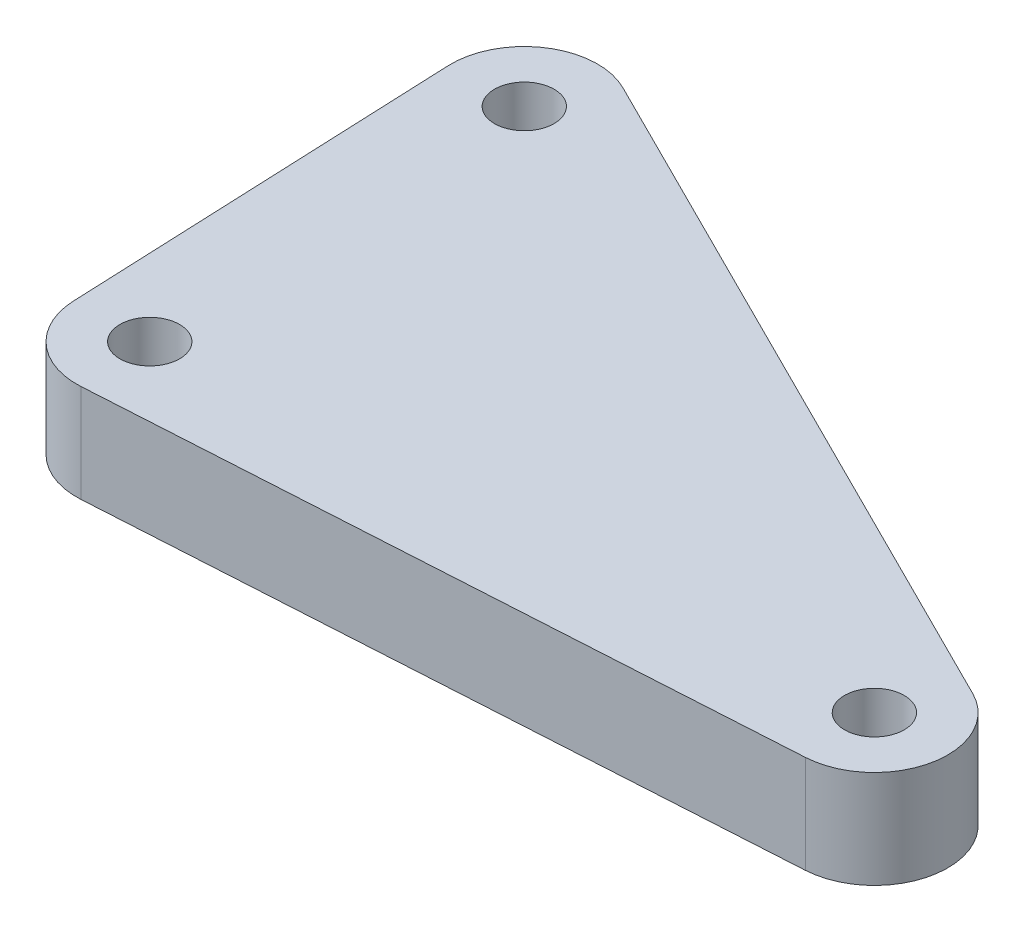
ISO-10303-21;
HEADER;
FILE_DESCRIPTION(('STEP AP214'),'2;1');
FILE_NAME('part.step','',(''),(''),'','','');
FILE_SCHEMA(('AUTOMOTIVE_DESIGN { 1 0 10303 214 1 1 1 1 }'));
ENDSEC;
DATA;
#1=APPLICATION_CONTEXT('core data for automotive mechanical design processes');
#2=APPLICATION_PROTOCOL_DEFINITION('international standard','automotive_design',2000,#1);
#3=PRODUCT_CONTEXT('',#1,'mechanical');
#4=PRODUCT('Part','Part','',(#3));
#5=PRODUCT_RELATED_PRODUCT_CATEGORY('part','',(#4));
#6=PRODUCT_DEFINITION_FORMATION('','',#4);
#7=PRODUCT_DEFINITION_CONTEXT('part definition',#1,'design');
#8=PRODUCT_DEFINITION('design','',#6,#7);
#9=PRODUCT_DEFINITION_SHAPE('','',#8);
#10=(LENGTH_UNIT() NAMED_UNIT(*) SI_UNIT(.MILLI.,.METRE.));
#11=(NAMED_UNIT(*) PLANE_ANGLE_UNIT() SI_UNIT($,.RADIAN.));
#12=(NAMED_UNIT(*) SI_UNIT($,.STERADIAN.) SOLID_ANGLE_UNIT());
#13=UNCERTAINTY_MEASURE_WITH_UNIT(LENGTH_MEASURE(1.E-05),#10,'distance_accuracy_value','');
#14=(GEOMETRIC_REPRESENTATION_CONTEXT(3) GLOBAL_UNCERTAINTY_ASSIGNED_CONTEXT((#13)) GLOBAL_UNIT_ASSIGNED_CONTEXT((#10,
#11,#12)) REPRESENTATION_CONTEXT('',''));
#15=CARTESIAN_POINT('',(0.,0.,0.));
#16=DIRECTION('',(0.,0.,1.));
#17=DIRECTION('',(1.,0.,0.));
#18=AXIS2_PLACEMENT_3D('',#15,#16,#17);
#19=CARTESIAN_POINT('',(0.449213854238827,10.,7.4865350405351));
#20=DIRECTION('',(-0.0598951805651769,0.,-0.998204672071347));
#21=DIRECTION('',(-0.998204672071347,0.,0.0598951805651769));
#22=AXIS2_PLACEMENT_3D('',#19,#20,#21);
#23=PLANE('',#22);
#24=DIRECTION('',(0.998204672071347,0.,-0.0598951805651769));
#25=VECTOR('',#24,1.);
#26=CARTESIAN_POINT('',(0.449213854238827,0.,7.4865350405351));
#27=LINE('',#26,#25);
#28=CARTESIAN_POINT('',(-69.4251131907555,0.,11.6791976800975));
#29=VERTEX_POINT('',#28);
#30=CARTESIAN_POINT('',(0.44921385423903,0.,7.48653504053509));
#31=VERTEX_POINT('',#30);
#32=EDGE_CURVE('E137',#29,#31,#27,.T.);
#33=ORIENTED_EDGE('',*,*,#32,.T.);
#34=DIRECTION('',(0.,-1.,0.));
#35=VECTOR('',#34,1.);
#36=CARTESIAN_POINT('',(0.44921385423903,10.,7.48653504053509));
#37=LINE('',#36,#35);
#38=CARTESIAN_POINT('',(0.44921385423903,10.,7.48653504053509));
#39=VERTEX_POINT('',#38);
#40=EDGE_CURVE('E11',#39,#31,#37,.T.);
#41=ORIENTED_EDGE('',*,*,#40,.F.);
#42=DIRECTION('',(0.998204672071347,0.,-0.0598951805651769));
#43=VECTOR('',#42,1.);
#44=CARTESIAN_POINT('',(0.449213854238827,10.,7.4865350405351));
#45=LINE('',#44,#43);
#46=CARTESIAN_POINT('',(-69.4251131907555,10.,11.6791976800975));
#47=VERTEX_POINT('',#46);
#48=EDGE_CURVE('E160',#47,#39,#45,.T.);
#49=ORIENTED_EDGE('',*,*,#48,.F.);
#50=DIRECTION('',(0.,-1.,0.));
#51=VECTOR('',#50,1.);
#52=CARTESIAN_POINT('',(-69.4251131907555,10.,11.6791976800975));
#53=LINE('',#52,#51);
#54=EDGE_CURVE('E124',#47,#29,#53,.T.);
#55=ORIENTED_EDGE('',*,*,#54,.T.);
#56=EDGE_LOOP('',(#33,#41,#49,#55));
#57=FACE_BOUND('',#56,.T.);
#58=ADVANCED_FACE('F43',(#57),#23,.F.);
#59=CARTESIAN_POINT('',(0.,10.,0.));
#60=DIRECTION('',(0.,-1.,0.));
#61=DIRECTION('',(0.,0.,-1.));
#62=AXIS2_PLACEMENT_3D('',#59,#60,#61);
#63=CYLINDRICAL_SURFACE('',#62,7.5);
#64=CARTESIAN_POINT('',(0.,0.,0.));
#65=DIRECTION('',(0.,1.,0.));
#66=DIRECTION('',(0.,0.,1.));
#67=AXIS2_PLACEMENT_3D('',#64,#65,#66);
#68=CIRCLE('',#67,7.5);
#69=CARTESIAN_POINT('',(3.35361936621696,0.,-6.70844521081707));
#70=VERTEX_POINT('',#69);
#71=EDGE_CURVE('E140',#31,#70,#68,.T.);
#72=ORIENTED_EDGE('',*,*,#71,.T.);
#73=DIRECTION('',(0.,-1.,0.));
#74=VECTOR('',#73,1.);
#75=CARTESIAN_POINT('',(3.35361936621696,10.,-6.70844521081707));
#76=LINE('',#75,#74);
#77=CARTESIAN_POINT('',(3.35361936621696,10.,-6.70844521081707));
#78=VERTEX_POINT('',#77);
#79=EDGE_CURVE('E52',#78,#70,#76,.T.);
#80=ORIENTED_EDGE('',*,*,#79,.F.);
#81=CARTESIAN_POINT('',(0.,10.,0.));
#82=DIRECTION('',(0.,1.,0.));
#83=DIRECTION('',(0.,0.,1.));
#84=AXIS2_PLACEMENT_3D('',#81,#82,#83);
#85=CIRCLE('',#84,7.5);
#86=EDGE_CURVE('E97',#39,#78,#85,.T.);
#87=ORIENTED_EDGE('',*,*,#86,.F.);
#88=ORIENTED_EDGE('',*,*,#40,.T.);
#89=EDGE_LOOP('',(#72,#80,#87,#88));
#90=FACE_BOUND('',#89,.T.);
#91=ADVANCED_FACE('F175',(#90),#63,.T.);
#92=CARTESIAN_POINT('',(3.35361936621696,10.,-6.70844521081708));
#93=DIRECTION('',(-0.447149248828928,0.,0.894459361442277));
#94=DIRECTION('',(0.894459361442277,0.,0.447149248828928));
#95=AXIS2_PLACEMENT_3D('',#92,#93,#94);
#96=PLANE('',#95);
#97=DIRECTION('',(-0.894459361442277,0.,-0.447149248828928));
#98=VECTOR('',#97,1.);
#99=CARTESIAN_POINT('',(3.35361936621696,0.,-6.70844521081708));
#100=LINE('',#99,#98);
#101=CARTESIAN_POINT('',(-68.2031295491652,0.,-42.4803851171313));
#102=VERTEX_POINT('',#101);
#103=EDGE_CURVE('E142',#70,#102,#100,.T.);
#104=ORIENTED_EDGE('',*,*,#103,.T.);
#105=DIRECTION('',(0.,-1.,0.));
#106=VECTOR('',#105,1.);
#107=CARTESIAN_POINT('',(-68.2031295491652,10.,-42.4803851171313));
#108=LINE('',#107,#106);
#109=CARTESIAN_POINT('',(-68.2031295491652,10.,-42.4803851171313));
#110=VERTEX_POINT('',#109);
#111=EDGE_CURVE('E119',#110,#102,#108,.T.);
#112=ORIENTED_EDGE('',*,*,#111,.F.);
#113=DIRECTION('',(-0.894459361442277,0.,-0.447149248828928));
#114=VECTOR('',#113,1.);
#115=CARTESIAN_POINT('',(3.35361936621696,10.,-6.70844521081708));
#116=LINE('',#115,#114);
#117=EDGE_CURVE('E110',#78,#110,#116,.T.);
#118=ORIENTED_EDGE('',*,*,#117,.F.);
#119=ORIENTED_EDGE('',*,*,#79,.T.);
#120=EDGE_LOOP('',(#104,#112,#118,#119));
#121=FACE_BOUND('',#120,.T.);
#122=ADVANCED_FACE('F153',(#121),#96,.F.);
#123=CARTESIAN_POINT('',(-71.5567489153822,10.,-35.7719399063161));
#124=DIRECTION('',(0.,-1.,0.));
#125=DIRECTION('',(0.,0.,-1.));
#126=AXIS2_PLACEMENT_3D('',#123,#124,#125);
#127=CYLINDRICAL_SURFACE('',#126,7.49999999999835);
#128=CARTESIAN_POINT('',(-71.5567489153822,0.,-35.7719399063161));
#129=DIRECTION('',(0.,1.,0.));
#130=DIRECTION('',(0.,0.,1.));
#131=AXIS2_PLACEMENT_3D('',#128,#129,#130);
#132=CIRCLE('',#131,7.49999999999835);
#133=CARTESIAN_POINT('',(-79.0501118927327,0.,-35.4564858056166));
#134=VERTEX_POINT('',#133);
#135=EDGE_CURVE('E118',#102,#134,#132,.T.);
#136=ORIENTED_EDGE('',*,*,#135,.T.);
#137=DIRECTION('',(0.,-1.,0.));
#138=VECTOR('',#137,1.);
#139=CARTESIAN_POINT('',(-79.0501118927327,10.,-35.4564858056166));
#140=LINE('',#139,#138);
#141=CARTESIAN_POINT('',(-79.0501118927327,10.,-35.4564858056166));
#142=VERTEX_POINT('',#141);
#143=EDGE_CURVE('E115',#142,#134,#140,.T.);
#144=ORIENTED_EDGE('',*,*,#143,.F.);
#145=CARTESIAN_POINT('',(-71.5567489153822,10.,-35.7719399063161));
#146=DIRECTION('',(0.,1.,0.));
#147=DIRECTION('',(0.,0.,1.));
#148=AXIS2_PLACEMENT_3D('',#145,#146,#147);
#149=CIRCLE('',#148,7.49999999999835);
#150=EDGE_CURVE('E104',#110,#142,#149,.T.);
#151=ORIENTED_EDGE('',*,*,#150,.F.);
#152=ORIENTED_EDGE('',*,*,#111,.T.);
#153=EDGE_LOOP('',(#136,#144,#151,#152));
#154=FACE_BOUND('',#153,.T.);
#155=ADVANCED_FACE('F116',(#154),#127,.T.);
#156=CARTESIAN_POINT('',(-77.4202657057961,10.,3.25922291070002));
#157=DIRECTION('',(0.999115063646965,0.,-0.0420605467596568));
#158=DIRECTION('',(-0.0420605467596568,0.,-0.999115063646965));
#159=AXIS2_PLACEMENT_3D('',#156,#157,#158);
#160=PLANE('',#159);
#161=DIRECTION('',(0.0420605467596568,0.,0.999115063646965));
#162=VECTOR('',#161,1.);
#163=CARTESIAN_POINT('',(-77.4202657057961,0.,3.25922291070002));
#164=LINE('',#163,#162);
#165=CARTESIAN_POINT('',(-77.3676900223464,0.,4.50811674026184));
#166=VERTEX_POINT('',#165);
#167=EDGE_CURVE('E83',#134,#166,#164,.T.);
#168=ORIENTED_EDGE('',*,*,#167,.T.);
#169=DIRECTION('',(0.,-1.,0.));
#170=VECTOR('',#169,1.);
#171=CARTESIAN_POINT('',(-77.3676900223464,10.,4.50811674026184));
#172=LINE('',#171,#170);
#173=CARTESIAN_POINT('',(-77.3676900223464,10.,4.50811674026184));
#174=VERTEX_POINT('',#173);
#175=EDGE_CURVE('E120',#174,#166,#172,.T.);
#176=ORIENTED_EDGE('',*,*,#175,.F.);
#177=DIRECTION('',(0.0420605467596568,0.,0.999115063646965));
#178=VECTOR('',#177,1.);
#179=CARTESIAN_POINT('',(-77.4202657057961,10.,3.25922291070002));
#180=LINE('',#179,#178);
#181=EDGE_CURVE('E108',#142,#174,#180,.T.);
#182=ORIENTED_EDGE('',*,*,#181,.F.);
#183=ORIENTED_EDGE('',*,*,#143,.T.);
#184=EDGE_LOOP('',(#168,#176,#182,#183));
#185=FACE_BOUND('',#184,.T.);
#186=ADVANCED_FACE('F122',(#185),#160,.F.);
#187=CARTESIAN_POINT('',(-71.5567489153822,10.,-35.7719399063161));
#188=DIRECTION('',(0.,-1.,0.));
#189=DIRECTION('',(0.,0.,-1.));
#190=AXIS2_PLACEMENT_3D('',#187,#188,#189);
#191=CYLINDRICAL_SURFACE('',#190,3.04999999999999);
#192=CARTESIAN_POINT('',(-71.5567489153822,10.,-35.7719399063161));
#193=DIRECTION('',(0.,1.,0.));
#194=DIRECTION('',(0.,0.,1.));
#195=AXIS2_PLACEMENT_3D('',#192,#193,#194);
#196=CIRCLE('',#195,3.04999999999999);
#197=CARTESIAN_POINT('',(-71.5567489153822,10.,-32.7219399063161));
#198=VERTEX_POINT('',#197);
#199=EDGE_CURVE('E268',#198,#198,#196,.T.);
#200=ORIENTED_EDGE('',*,*,#199,.T.);
#201=EDGE_LOOP('',(#200));
#202=FACE_BOUND('',#201,.T.);
#203=CARTESIAN_POINT('',(-71.5567489153822,0.,-35.7719399063161));
#204=DIRECTION('',(0.,1.,0.));
#205=DIRECTION('',(0.,0.,1.));
#206=AXIS2_PLACEMENT_3D('',#203,#204,#205);
#207=CIRCLE('',#206,3.04999999999999);
#208=CARTESIAN_POINT('',(-71.5567489153822,0.,-32.7219399063161));
#209=VERTEX_POINT('',#208);
#210=EDGE_CURVE('E134',#209,#209,#207,.T.);
#211=ORIENTED_EDGE('',*,*,#210,.F.);
#212=EDGE_LOOP('',(#211));
#213=FACE_BOUND('',#212,.T.);
#214=ADVANCED_FACE('F183',(#202,#213),#191,.F.);
#215=CARTESIAN_POINT('',(-69.8743270449943,10.,4.19266263956238));
#216=DIRECTION('',(0.,-1.,0.));
#217=DIRECTION('',(0.,0.,-1.));
#218=AXIS2_PLACEMENT_3D('',#215,#216,#217);
#219=CYLINDRICAL_SURFACE('',#218,3.04999999999999);
#220=CARTESIAN_POINT('',(-69.8743270449943,10.,4.19266263956238));
#221=DIRECTION('',(0.,1.,0.));
#222=DIRECTION('',(0.,0.,1.));
#223=AXIS2_PLACEMENT_3D('',#220,#221,#222);
#224=CIRCLE('',#223,3.04999999999999);
#225=CARTESIAN_POINT('',(-69.8743270449943,10.,7.24266263956237));
#226=VERTEX_POINT('',#225);
#227=EDGE_CURVE('E193',#226,#226,#224,.T.);
#228=ORIENTED_EDGE('',*,*,#227,.T.);
#229=EDGE_LOOP('',(#228));
#230=FACE_BOUND('',#229,.T.);
#231=CARTESIAN_POINT('',(-69.8743270449943,0.,4.19266263956238));
#232=DIRECTION('',(0.,1.,0.));
#233=DIRECTION('',(0.,0.,1.));
#234=AXIS2_PLACEMENT_3D('',#231,#232,#233);
#235=CIRCLE('',#234,3.04999999999999);
#236=CARTESIAN_POINT('',(-69.8743270449943,0.,7.24266263956237));
#237=VERTEX_POINT('',#236);
#238=EDGE_CURVE('E131',#237,#237,#235,.T.);
#239=ORIENTED_EDGE('',*,*,#238,.F.);
#240=EDGE_LOOP('',(#239));
#241=FACE_BOUND('',#240,.T.);
#242=ADVANCED_FACE('F170',(#230,#241),#219,.F.);
#243=CARTESIAN_POINT('',(0.,10.,0.));
#244=DIRECTION('',(0.,-1.,0.));
#245=DIRECTION('',(0.,0.,-1.));
#246=AXIS2_PLACEMENT_3D('',#243,#244,#245);
#247=CYLINDRICAL_SURFACE('',#246,3.05);
#248=CARTESIAN_POINT('',(0.,10.,0.));
#249=DIRECTION('',(0.,1.,0.));
#250=DIRECTION('',(0.,0.,1.));
#251=AXIS2_PLACEMENT_3D('',#248,#249,#250);
#252=CIRCLE('',#251,3.05);
#253=CARTESIAN_POINT('',(0.,10.,3.05));
#254=VERTEX_POINT('',#253);
#255=EDGE_CURVE('E147',#254,#254,#252,.T.);
#256=ORIENTED_EDGE('',*,*,#255,.T.);
#257=EDGE_LOOP('',(#256));
#258=FACE_BOUND('',#257,.T.);
#259=CARTESIAN_POINT('',(0.,0.,0.));
#260=DIRECTION('',(0.,1.,0.));
#261=DIRECTION('',(0.,0.,1.));
#262=AXIS2_PLACEMENT_3D('',#259,#260,#261);
#263=CIRCLE('',#262,3.05);
#264=CARTESIAN_POINT('',(0.,0.,3.05));
#265=VERTEX_POINT('',#264);
#266=EDGE_CURVE('E128',#265,#265,#263,.T.);
#267=ORIENTED_EDGE('',*,*,#266,.F.);
#268=EDGE_LOOP('',(#267));
#269=FACE_BOUND('',#268,.T.);
#270=ADVANCED_FACE('F45',(#258,#269),#247,.F.);
#271=CARTESIAN_POINT('',(-69.8743270449943,10.,4.19266263956238));
#272=DIRECTION('',(0.,-1.,0.));
#273=DIRECTION('',(0.,0.,-1.));
#274=AXIS2_PLACEMENT_3D('',#271,#272,#273);
#275=CYLINDRICAL_SURFACE('',#274,7.50000000000001);
#276=CARTESIAN_POINT('',(-69.8743270449943,0.,4.19266263956238));
#277=DIRECTION('',(0.,1.,0.));
#278=DIRECTION('',(0.,0.,1.));
#279=AXIS2_PLACEMENT_3D('',#276,#277,#278);
#280=CIRCLE('',#279,7.50000000000001);
#281=EDGE_CURVE('E89',#166,#29,#280,.T.);
#282=ORIENTED_EDGE('',*,*,#281,.T.);
#283=ORIENTED_EDGE('',*,*,#54,.F.);
#284=CARTESIAN_POINT('',(-69.8743270449943,10.,4.19266263956238));
#285=DIRECTION('',(0.,1.,0.));
#286=DIRECTION('',(0.,0.,1.));
#287=AXIS2_PLACEMENT_3D('',#284,#285,#286);
#288=CIRCLE('',#287,7.50000000000001);
#289=EDGE_CURVE('E60',#174,#47,#288,.T.);
#290=ORIENTED_EDGE('',*,*,#289,.F.);
#291=ORIENTED_EDGE('',*,*,#175,.T.);
#292=EDGE_LOOP('',(#282,#283,#290,#291));
#293=FACE_BOUND('',#292,.T.);
#294=ADVANCED_FACE('F161',(#293),#275,.T.);
#295=CARTESIAN_POINT('',(0.,10.,0.));
#296=DIRECTION('',(0.,1.,0.));
#297=DIRECTION('',(0.,0.,1.));
#298=AXIS2_PLACEMENT_3D('',#295,#296,#297);
#299=PLANE('',#298);
#300=ORIENTED_EDGE('',*,*,#255,.F.);
#301=EDGE_LOOP('',(#300));
#302=FACE_BOUND('',#301,.T.);
#303=ORIENTED_EDGE('',*,*,#227,.F.);
#304=EDGE_LOOP('',(#303));
#305=FACE_BOUND('',#304,.T.);
#306=ORIENTED_EDGE('',*,*,#199,.F.);
#307=EDGE_LOOP('',(#306));
#308=FACE_BOUND('',#307,.T.);
#309=ORIENTED_EDGE('',*,*,#48,.T.);
#310=ORIENTED_EDGE('',*,*,#86,.T.);
#311=ORIENTED_EDGE('',*,*,#117,.T.);
#312=ORIENTED_EDGE('',*,*,#150,.T.);
#313=ORIENTED_EDGE('',*,*,#181,.T.);
#314=ORIENTED_EDGE('',*,*,#289,.T.);
#315=EDGE_LOOP('',(#309,#310,#311,#312,#313,#314));
#316=FACE_BOUND('',#315,.T.);
#317=ADVANCED_FACE('F106',(#302,#305,#308,#316),#299,.T.);
#318=CARTESIAN_POINT('',(0.,0.,0.));
#319=DIRECTION('',(0.,1.,0.));
#320=DIRECTION('',(0.,0.,1.));
#321=AXIS2_PLACEMENT_3D('',#318,#319,#320);
#322=PLANE('',#321);
#323=ORIENTED_EDGE('',*,*,#266,.T.);
#324=EDGE_LOOP('',(#323));
#325=FACE_BOUND('',#324,.T.);
#326=ORIENTED_EDGE('',*,*,#238,.T.);
#327=EDGE_LOOP('',(#326));
#328=FACE_BOUND('',#327,.T.);
#329=ORIENTED_EDGE('',*,*,#210,.T.);
#330=EDGE_LOOP('',(#329));
#331=FACE_BOUND('',#330,.T.);
#332=ORIENTED_EDGE('',*,*,#32,.F.);
#333=ORIENTED_EDGE('',*,*,#281,.F.);
#334=ORIENTED_EDGE('',*,*,#167,.F.);
#335=ORIENTED_EDGE('',*,*,#135,.F.);
#336=ORIENTED_EDGE('',*,*,#103,.F.);
#337=ORIENTED_EDGE('',*,*,#71,.F.);
#338=EDGE_LOOP('',(#332,#333,#334,#335,#336,#337));
#339=FACE_BOUND('',#338,.T.);
#340=ADVANCED_FACE('F156',(#325,#328,#331,#339),#322,.F.);
#341=CLOSED_SHELL('',(#58,#91,#122,#155,#186,#214,#242,#270,#294,#317,#340));
#342=MANIFOLD_SOLID_BREP('B2',#341);
#343=ADVANCED_BREP_SHAPE_REPRESENTATION('',(#18,#342),#14);
#344=SHAPE_DEFINITION_REPRESENTATION(#9,#343);
ENDSEC;
END-ISO-10303-21;
